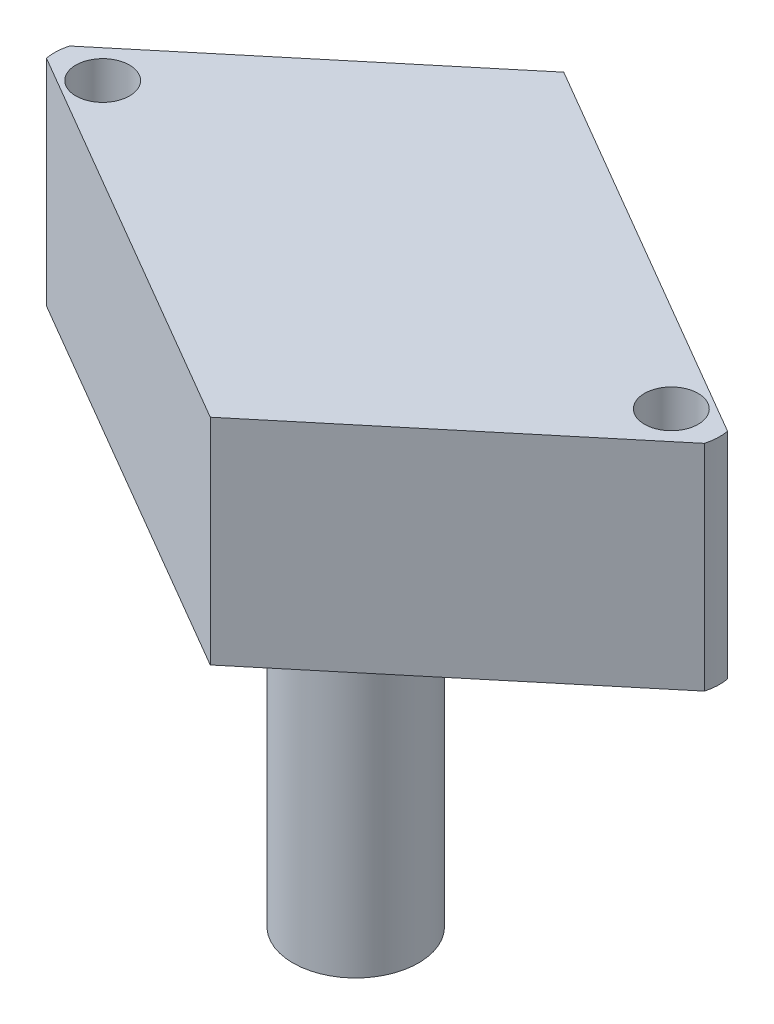
ISO-10303-21;
HEADER;
FILE_DESCRIPTION(('STEP AP214'),'2;1');
FILE_NAME('part.step','',(''),(''),'','','');
FILE_SCHEMA(('AUTOMOTIVE_DESIGN { 1 0 10303 214 1 1 1 1 }'));
ENDSEC;
DATA;
#1=APPLICATION_CONTEXT('core data for automotive mechanical design processes');
#2=APPLICATION_PROTOCOL_DEFINITION('international standard','automotive_design',2000,#1);
#3=PRODUCT_CONTEXT('',#1,'mechanical');
#4=PRODUCT('Part','Part','',(#3));
#5=PRODUCT_RELATED_PRODUCT_CATEGORY('part','',(#4));
#6=PRODUCT_DEFINITION_FORMATION('','',#4);
#7=PRODUCT_DEFINITION_CONTEXT('part definition',#1,'design');
#8=PRODUCT_DEFINITION('design','',#6,#7);
#9=PRODUCT_DEFINITION_SHAPE('','',#8);
#10=(LENGTH_UNIT() NAMED_UNIT(*) SI_UNIT(.MILLI.,.METRE.));
#11=(NAMED_UNIT(*) PLANE_ANGLE_UNIT() SI_UNIT($,.RADIAN.));
#12=(NAMED_UNIT(*) SI_UNIT($,.STERADIAN.) SOLID_ANGLE_UNIT());
#13=UNCERTAINTY_MEASURE_WITH_UNIT(LENGTH_MEASURE(1.E-05),#10,'distance_accuracy_value','');
#14=(GEOMETRIC_REPRESENTATION_CONTEXT(3) GLOBAL_UNCERTAINTY_ASSIGNED_CONTEXT((#13)) GLOBAL_UNIT_ASSIGNED_CONTEXT((#10,
#11,#12)) REPRESENTATION_CONTEXT('',''));
#15=CARTESIAN_POINT('',(0.,0.,0.));
#16=DIRECTION('',(0.,0.,1.));
#17=DIRECTION('',(1.,0.,0.));
#18=AXIS2_PLACEMENT_3D('',#15,#16,#17);
#19=CARTESIAN_POINT('',(8.77656522937811,10.,10.5495211907733));
#20=DIRECTION('',(-0.639551897681025,0.,-0.768747923686692));
#21=DIRECTION('',(-0.768747923686692,0.,0.639551897681025));
#22=AXIS2_PLACEMENT_3D('',#19,#20,#21);
#23=PLANE('',#22);
#24=DIRECTION('',(0.768747923686692,0.,-0.639551897681025));
#25=VECTOR('',#24,1.);
#26=CARTESIAN_POINT('',(8.77656522937811,0.,10.5495211907733));
#27=LINE('',#26,#25);
#28=CARTESIAN_POINT('',(6.04372532397628,0.,12.8230791331171));
#29=VERTEX_POINT('',#28);
#30=CARTESIAN_POINT('',(18.6115867215435,0.,2.36737660834241));
#31=VERTEX_POINT('',#30);
#32=EDGE_CURVE('E152',#29,#31,#27,.T.);
#33=ORIENTED_EDGE('',*,*,#32,.T.);
#34=DIRECTION('',(0.,-1.,0.));
#35=VECTOR('',#34,1.);
#36=CARTESIAN_POINT('',(18.6115867215435,10.,2.36737660834241));
#37=LINE('',#36,#35);
#38=CARTESIAN_POINT('',(18.6115867215435,10.,2.36737660834241));
#39=VERTEX_POINT('',#38);
#40=EDGE_CURVE('E11',#39,#31,#37,.T.);
#41=ORIENTED_EDGE('',*,*,#40,.F.);
#42=DIRECTION('',(0.768747923686692,0.,-0.639551897681025));
#43=VECTOR('',#42,1.);
#44=CARTESIAN_POINT('',(8.77656522937811,10.,10.5495211907733));
#45=LINE('',#44,#43);
#46=CARTESIAN_POINT('',(6.04372532397628,10.,12.8230791331171));
#47=VERTEX_POINT('',#46);
#48=EDGE_CURVE('E188',#47,#39,#45,.T.);
#49=ORIENTED_EDGE('',*,*,#48,.F.);
#50=DIRECTION('',(0.,-1.,0.));
#51=VECTOR('',#50,1.);
#52=CARTESIAN_POINT('',(6.04372532397628,10.,12.8230791331171));
#53=LINE('',#52,#51);
#54=EDGE_CURVE('E139',#47,#29,#53,.T.);
#55=ORIENTED_EDGE('',*,*,#54,.T.);
#56=EDGE_LOOP('',(#33,#41,#49,#55));
#57=FACE_BOUND('',#56,.T.);
#58=ADVANCED_FACE('F42',(#57),#23,.F.);
#59=CARTESIAN_POINT('',(16.45,10.,1.74284250579329));
#60=DIRECTION('',(0.,-1.,0.));
#61=DIRECTION('',(0.,0.,-1.));
#62=AXIS2_PLACEMENT_3D('',#59,#60,#61);
#63=CYLINDRICAL_SURFACE('',#62,2.25);
#64=CARTESIAN_POINT('',(16.45,0.,1.74284250579329));
#65=DIRECTION('',(0.,1.,0.));
#66=DIRECTION('',(0.,0.,1.));
#67=AXIS2_PLACEMENT_3D('',#64,#65,#66);
#68=CIRCLE('',#67,2.25);
#69=CARTESIAN_POINT('',(18.662730232351,0.,1.33501298400796));
#70=VERTEX_POINT('',#69);
#71=EDGE_CURVE('E156',#31,#70,#68,.T.);
#72=ORIENTED_EDGE('',*,*,#71,.T.);
#73=DIRECTION('',(0.,-1.,0.));
#74=VECTOR('',#73,1.);
#75=CARTESIAN_POINT('',(18.662730232351,10.,1.33501298400796));
#76=LINE('',#75,#74);
#77=CARTESIAN_POINT('',(18.662730232351,10.,1.33501298400796));
#78=VERTEX_POINT('',#77);
#79=EDGE_CURVE('E52',#78,#70,#76,.T.);
#80=ORIENTED_EDGE('',*,*,#79,.F.);
#81=CARTESIAN_POINT('',(16.45,10.,1.74284250579329));
#82=DIRECTION('',(0.,1.,0.));
#83=DIRECTION('',(0.,0.,1.));
#84=AXIS2_PLACEMENT_3D('',#81,#82,#83);
#85=CIRCLE('',#84,2.25);
#86=EDGE_CURVE('E103',#39,#78,#85,.T.);
#87=ORIENTED_EDGE('',*,*,#86,.F.);
#88=ORIENTED_EDGE('',*,*,#40,.T.);
#89=EDGE_LOOP('',(#72,#80,#87,#88));
#90=FACE_BOUND('',#89,.T.);
#91=ADVANCED_FACE('F181',(#90),#63,.T.);
#92=CARTESIAN_POINT('',(4.15312449004631,10.,-7.1238838759695));
#93=DIRECTION('',(0.503647119423808,0.,-0.863909473901115));
#94=DIRECTION('',(-0.863909473901115,0.,-0.503647119423808));
#95=AXIS2_PLACEMENT_3D('',#92,#93,#94);
#96=PLANE('',#95);
#97=DIRECTION('',(0.863909473901115,0.,0.503647119423808));
#98=VECTOR('',#97,1.);
#99=CARTESIAN_POINT('',(4.15312449004631,0.,-7.1238838759695));
#100=LINE('',#99,#98);
#101=CARTESIAN_POINT('',(0.356274676023695,0.,-9.33739412153047));
#102=VERTEX_POINT('',#101);
#103=EDGE_CURVE('E160',#102,#70,#100,.T.);
#104=ORIENTED_EDGE('',*,*,#103,.F.);
#105=DIRECTION('',(0.,-1.,0.));
#106=VECTOR('',#105,1.);
#107=CARTESIAN_POINT('',(0.356274676023695,10.,-9.33739412153047));
#108=LINE('',#107,#106);
#109=CARTESIAN_POINT('',(0.356274676023695,10.,-9.33739412153047));
#110=VERTEX_POINT('',#109);
#111=EDGE_CURVE('E125',#110,#102,#108,.T.);
#112=ORIENTED_EDGE('',*,*,#111,.F.);
#113=DIRECTION('',(0.863909473901115,0.,0.503647119423808));
#114=VECTOR('',#113,1.);
#115=CARTESIAN_POINT('',(4.15312449004631,10.,-7.1238838759695));
#116=LINE('',#115,#114);
#117=EDGE_CURVE('E131',#110,#78,#116,.T.);
#118=ORIENTED_EDGE('',*,*,#117,.T.);
#119=ORIENTED_EDGE('',*,*,#79,.T.);
#120=EDGE_LOOP('',(#104,#112,#118,#119));
#121=FACE_BOUND('',#120,.T.);
#122=ADVANCED_FACE('F180',(#121),#96,.T.);
#123=CARTESIAN_POINT('',(-4.44504314555254,10.,-5.34298733414994));
#124=DIRECTION('',(-0.639551897681025,0.,-0.768747923686692));
#125=DIRECTION('',(-0.768747923686692,0.,0.639551897681025));
#126=AXIS2_PLACEMENT_3D('',#123,#124,#125);
#127=PLANE('',#126);
#128=DIRECTION('',(0.768747923686692,0.,-0.639551897681025));
#129=VECTOR('',#128,1.);
#130=CARTESIAN_POINT('',(-4.44504314555254,0.,-5.34298733414994));
#131=LINE('',#130,#129);
#132=CARTESIAN_POINT('',(-12.2115867215435,0.,1.11830840324417));
#133=VERTEX_POINT('',#132);
#134=EDGE_CURVE('E119',#133,#102,#131,.T.);
#135=ORIENTED_EDGE('',*,*,#134,.F.);
#136=DIRECTION('',(0.,-1.,0.));
#137=VECTOR('',#136,1.);
#138=CARTESIAN_POINT('',(-12.2115867215435,10.,1.11830840324417));
#139=LINE('',#138,#137);
#140=CARTESIAN_POINT('',(-12.2115867215435,10.,1.11830840324417));
#141=VERTEX_POINT('',#140);
#142=EDGE_CURVE('E114',#141,#133,#139,.T.);
#143=ORIENTED_EDGE('',*,*,#142,.F.);
#144=DIRECTION('',(0.768747923686692,0.,-0.639551897681025));
#145=VECTOR('',#144,1.);
#146=CARTESIAN_POINT('',(-4.44504314555254,10.,-5.34298733414994));
#147=LINE('',#146,#145);
#148=EDGE_CURVE('E117',#141,#110,#147,.T.);
#149=ORIENTED_EDGE('',*,*,#148,.T.);
#150=ORIENTED_EDGE('',*,*,#111,.T.);
#151=EDGE_LOOP('',(#135,#143,#149,#150));
#152=FACE_BOUND('',#151,.T.);
#153=ADVANCED_FACE('F116',(#152),#127,.T.);
#154=CARTESIAN_POINT('',(-10.05,10.,1.74284250579329));
#155=DIRECTION('',(0.,-1.,0.));
#156=DIRECTION('',(0.,0.,-1.));
#157=AXIS2_PLACEMENT_3D('',#154,#155,#156);
#158=CYLINDRICAL_SURFACE('',#157,2.25);
#159=CARTESIAN_POINT('',(-10.05,0.,1.74284250579329));
#160=DIRECTION('',(0.,1.,0.));
#161=DIRECTION('',(0.,0.,1.));
#162=AXIS2_PLACEMENT_3D('',#159,#160,#161);
#163=CIRCLE('',#162,2.25);
#164=CARTESIAN_POINT('',(-12.2627302323511,0.,2.15067202757863));
#165=VERTEX_POINT('',#164);
#166=EDGE_CURVE('E166',#165,#133,#163,.F.);
#167=ORIENTED_EDGE('',*,*,#166,.F.);
#168=DIRECTION('',(0.,-1.,0.));
#169=VECTOR('',#168,1.);
#170=CARTESIAN_POINT('',(-12.2627302323511,10.,2.15067202757863));
#171=LINE('',#170,#169);
#172=CARTESIAN_POINT('',(-12.2627302323511,10.,2.15067202757863));
#173=VERTEX_POINT('',#172);
#174=EDGE_CURVE('E91',#173,#165,#171,.T.);
#175=ORIENTED_EDGE('',*,*,#174,.F.);
#176=CARTESIAN_POINT('',(-10.05,10.,1.74284250579329));
#177=DIRECTION('',(0.,1.,0.));
#178=DIRECTION('',(0.,0.,1.));
#179=AXIS2_PLACEMENT_3D('',#176,#177,#178);
#180=CIRCLE('',#179,2.25);
#181=EDGE_CURVE('E129',#173,#141,#180,.F.);
#182=ORIENTED_EDGE('',*,*,#181,.T.);
#183=ORIENTED_EDGE('',*,*,#142,.T.);
#184=EDGE_LOOP('',(#167,#175,#182,#183));
#185=FACE_BOUND('',#184,.T.);
#186=ADVANCED_FACE('F134',(#185),#158,.T.);
#187=CARTESIAN_POINT('',(-10.05,10.,1.74284250579329));
#188=DIRECTION('',(0.,-1.,0.));
#189=DIRECTION('',(0.,0.,-1.));
#190=AXIS2_PLACEMENT_3D('',#187,#188,#189);
#191=CYLINDRICAL_SURFACE('',#190,1.25);
#192=CARTESIAN_POINT('',(-10.05,10.,1.74284250579329));
#193=DIRECTION('',(0.,1.,0.));
#194=DIRECTION('',(0.,0.,1.));
#195=AXIS2_PLACEMENT_3D('',#192,#193,#194);
#196=CIRCLE('',#195,1.25);
#197=CARTESIAN_POINT('',(-10.05,10.,2.9928425057933));
#198=VERTEX_POINT('',#197);
#199=EDGE_CURVE('E217',#198,#198,#196,.T.);
#200=ORIENTED_EDGE('',*,*,#199,.T.);
#201=EDGE_LOOP('',(#200));
#202=FACE_BOUND('',#201,.T.);
#203=CARTESIAN_POINT('',(-10.05,0.,1.74284250579329));
#204=DIRECTION('',(0.,1.,0.));
#205=DIRECTION('',(0.,0.,1.));
#206=AXIS2_PLACEMENT_3D('',#203,#204,#205);
#207=CIRCLE('',#206,1.25);
#208=CARTESIAN_POINT('',(-10.05,0.,2.9928425057933));
#209=VERTEX_POINT('',#208);
#210=EDGE_CURVE('E147',#209,#209,#207,.T.);
#211=ORIENTED_EDGE('',*,*,#210,.F.);
#212=EDGE_LOOP('',(#211));
#213=FACE_BOUND('',#212,.T.);
#214=ADVANCED_FACE('F198',(#202,#213),#191,.F.);
#215=CARTESIAN_POINT('',(16.45,10.,1.74284250579329));
#216=DIRECTION('',(0.,-1.,0.));
#217=DIRECTION('',(0.,0.,-1.));
#218=AXIS2_PLACEMENT_3D('',#215,#216,#217);
#219=CYLINDRICAL_SURFACE('',#218,1.25);
#220=CARTESIAN_POINT('',(16.45,10.,1.74284250579329));
#221=DIRECTION('',(0.,1.,0.));
#222=DIRECTION('',(0.,0.,1.));
#223=AXIS2_PLACEMENT_3D('',#220,#221,#222);
#224=CIRCLE('',#223,1.25);
#225=CARTESIAN_POINT('',(16.45,10.,2.9928425057933));
#226=VERTEX_POINT('',#225);
#227=EDGE_CURVE('E171',#226,#226,#224,.T.);
#228=ORIENTED_EDGE('',*,*,#227,.T.);
#229=EDGE_LOOP('',(#228));
#230=FACE_BOUND('',#229,.T.);
#231=CARTESIAN_POINT('',(16.45,0.,1.74284250579329));
#232=DIRECTION('',(0.,1.,0.));
#233=DIRECTION('',(0.,0.,1.));
#234=AXIS2_PLACEMENT_3D('',#231,#232,#233);
#235=CIRCLE('',#234,1.25);
#236=CARTESIAN_POINT('',(16.45,0.,2.9928425057933));
#237=VERTEX_POINT('',#236);
#238=EDGE_CURVE('E143',#237,#237,#235,.T.);
#239=ORIENTED_EDGE('',*,*,#238,.F.);
#240=EDGE_LOOP('',(#239));
#241=FACE_BOUND('',#240,.T.);
#242=ADVANCED_FACE('F44',(#230,#241),#219,.F.);
#243=CARTESIAN_POINT('',(-4.04633857871928,10.,6.94071324534993));
#244=DIRECTION('',(0.503647119423807,0.,-0.863909473901115));
#245=DIRECTION('',(-0.863909473901115,0.,-0.503647119423807));
#246=AXIS2_PLACEMENT_3D('',#243,#244,#245);
#247=PLANE('',#246);
#248=DIRECTION('',(0.863909473901115,0.,0.503647119423807));
#249=VECTOR('',#248,1.);
#250=CARTESIAN_POINT('',(-4.04633857871928,0.,6.94071324534993));
#251=LINE('',#250,#249);
#252=EDGE_CURVE('E94',#165,#29,#251,.T.);
#253=ORIENTED_EDGE('',*,*,#252,.T.);
#254=ORIENTED_EDGE('',*,*,#54,.F.);
#255=DIRECTION('',(0.863909473901115,0.,0.503647119423807));
#256=VECTOR('',#255,1.);
#257=CARTESIAN_POINT('',(-4.04633857871928,10.,6.94071324534993));
#258=LINE('',#257,#256);
#259=EDGE_CURVE('E63',#173,#47,#258,.T.);
#260=ORIENTED_EDGE('',*,*,#259,.F.);
#261=ORIENTED_EDGE('',*,*,#174,.T.);
#262=EDGE_LOOP('',(#253,#254,#260,#261));
#263=FACE_BOUND('',#262,.T.);
#264=ADVANCED_FACE('F189',(#263),#247,.F.);
#265=CARTESIAN_POINT('',(0.,10.,0.));
#266=DIRECTION('',(0.,1.,0.));
#267=DIRECTION('',(0.,0.,1.));
#268=AXIS2_PLACEMENT_3D('',#265,#266,#267);
#269=PLANE('',#268);
#270=ORIENTED_EDGE('',*,*,#227,.F.);
#271=EDGE_LOOP('',(#270));
#272=FACE_BOUND('',#271,.T.);
#273=ORIENTED_EDGE('',*,*,#199,.F.);
#274=EDGE_LOOP('',(#273));
#275=FACE_BOUND('',#274,.T.);
#276=ORIENTED_EDGE('',*,*,#48,.T.);
#277=ORIENTED_EDGE('',*,*,#86,.T.);
#278=ORIENTED_EDGE('',*,*,#117,.F.);
#279=ORIENTED_EDGE('',*,*,#148,.F.);
#280=ORIENTED_EDGE('',*,*,#181,.F.);
#281=ORIENTED_EDGE('',*,*,#259,.T.);
#282=EDGE_LOOP('',(#276,#277,#278,#279,#280,#281));
#283=FACE_BOUND('',#282,.T.);
#284=ADVANCED_FACE('F128',(#272,#275,#283),#269,.T.);
#285=CARTESIAN_POINT('',(0.,0.,0.));
#286=DIRECTION('',(0.,1.,0.));
#287=DIRECTION('',(0.,0.,1.));
#288=AXIS2_PLACEMENT_3D('',#285,#286,#287);
#289=PLANE('',#288);
#290=CARTESIAN_POINT('',(0.,0.,0.));
#291=DIRECTION('',(0.,1.,0.));
#292=DIRECTION('',(0.,0.,1.));
#293=AXIS2_PLACEMENT_3D('',#290,#291,#292);
#294=CIRCLE('',#293,2.925);
#295=CARTESIAN_POINT('',(0.,0.,2.925));
#296=VERTEX_POINT('',#295);
#297=EDGE_CURVE('E239',#296,#296,#294,.T.);
#298=ORIENTED_EDGE('',*,*,#297,.T.);
#299=EDGE_LOOP('',(#298));
#300=FACE_BOUND('',#299,.T.);
#301=ORIENTED_EDGE('',*,*,#238,.T.);
#302=EDGE_LOOP('',(#301));
#303=FACE_BOUND('',#302,.T.);
#304=ORIENTED_EDGE('',*,*,#210,.T.);
#305=EDGE_LOOP('',(#304));
#306=FACE_BOUND('',#305,.T.);
#307=ORIENTED_EDGE('',*,*,#32,.F.);
#308=ORIENTED_EDGE('',*,*,#252,.F.);
#309=ORIENTED_EDGE('',*,*,#166,.T.);
#310=ORIENTED_EDGE('',*,*,#134,.T.);
#311=ORIENTED_EDGE('',*,*,#103,.T.);
#312=ORIENTED_EDGE('',*,*,#71,.F.);
#313=EDGE_LOOP('',(#307,#308,#309,#310,#311,#312));
#314=FACE_BOUND('',#313,.T.);
#315=ADVANCED_FACE('F185',(#300,#303,#306,#314),#289,.F.);
#316=CARTESIAN_POINT('',(0.,-20.,0.));
#317=DIRECTION('',(0.,1.,0.));
#318=DIRECTION('',(0.,0.,1.));
#319=AXIS2_PLACEMENT_3D('',#316,#317,#318);
#320=CYLINDRICAL_SURFACE('',#319,2.925);
#321=CARTESIAN_POINT('',(0.,-20.,0.));
#322=DIRECTION('',(0.,1.,0.));
#323=DIRECTION('',(0.,0.,1.));
#324=AXIS2_PLACEMENT_3D('',#321,#322,#323);
#325=CIRCLE('',#324,2.925);
#326=CARTESIAN_POINT('',(0.,-20.,2.925));
#327=VERTEX_POINT('',#326);
#328=EDGE_CURVE('E148',#327,#327,#325,.T.);
#329=ORIENTED_EDGE('',*,*,#328,.T.);
#330=EDGE_LOOP('',(#329));
#331=FACE_BOUND('',#330,.T.);
#332=ORIENTED_EDGE('',*,*,#297,.F.);
#333=EDGE_LOOP('',(#332));
#334=FACE_BOUND('',#333,.T.);
#335=ADVANCED_FACE('F221',(#331,#334),#320,.T.);
#336=CARTESIAN_POINT('',(0.,-20.,0.));
#337=DIRECTION('',(0.,1.,0.));
#338=DIRECTION('',(0.,0.,1.));
#339=AXIS2_PLACEMENT_3D('',#336,#337,#338);
#340=PLANE('',#339);
#341=ORIENTED_EDGE('',*,*,#328,.F.);
#342=EDGE_LOOP('',(#341));
#343=FACE_BOUND('',#342,.T.);
#344=ADVANCED_FACE('F226',(#343),#340,.F.);
#345=CLOSED_SHELL('',(#58,#91,#122,#153,#186,#214,#242,#264,#284,#315,#335,#344));
#346=MANIFOLD_SOLID_BREP('B2',#345);
#347=ADVANCED_BREP_SHAPE_REPRESENTATION('',(#18,#346),#14);
#348=SHAPE_DEFINITION_REPRESENTATION(#9,#347);
ENDSEC;
END-ISO-10303-21;
